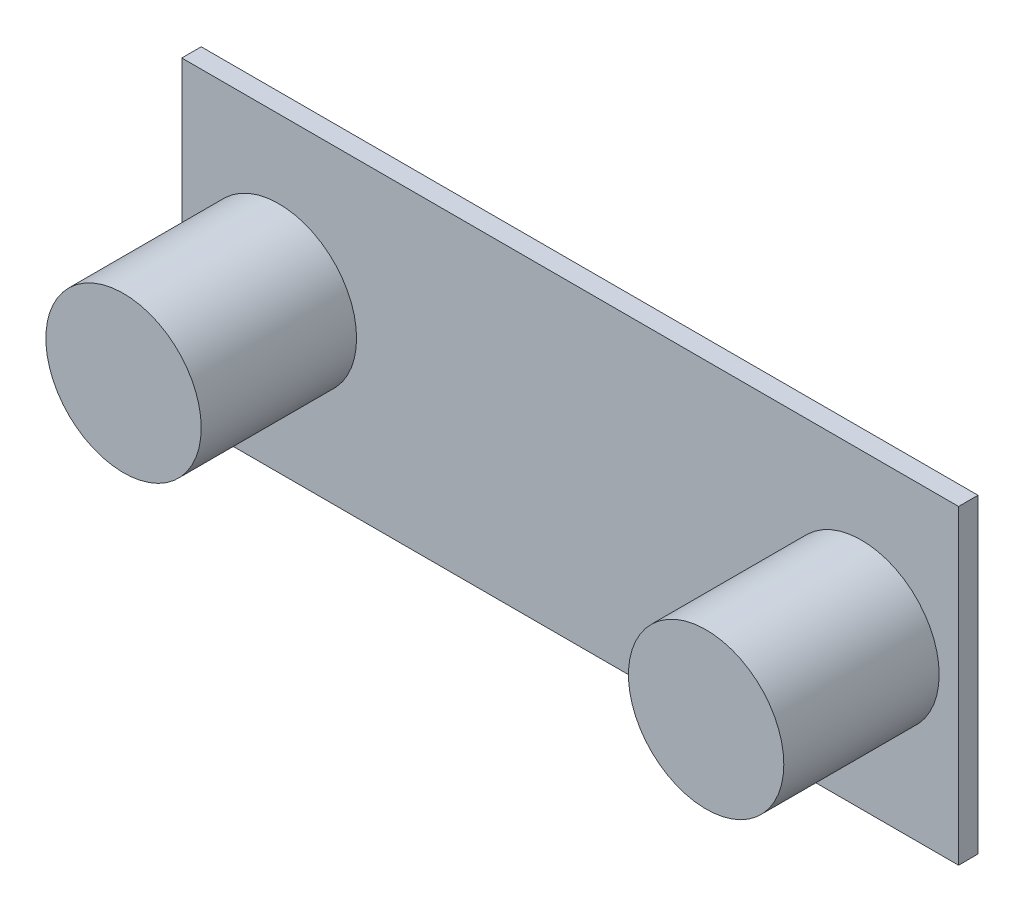
ISO-10303-21;
HEADER;
FILE_DESCRIPTION(('STEP AP214'),'2;1');
FILE_NAME('part.step','',(''),(''),'','','');
FILE_SCHEMA(('AUTOMOTIVE_DESIGN { 1 0 10303 214 1 1 1 1 }'));
ENDSEC;
DATA;
#1=APPLICATION_CONTEXT('core data for automotive mechanical design processes');
#2=APPLICATION_PROTOCOL_DEFINITION('international standard','automotive_design',2000,#1);
#3=PRODUCT_CONTEXT('',#1,'mechanical');
#4=PRODUCT('Part','Part','',(#3));
#5=PRODUCT_RELATED_PRODUCT_CATEGORY('part','',(#4));
#6=PRODUCT_DEFINITION_FORMATION('','',#4);
#7=PRODUCT_DEFINITION_CONTEXT('part definition',#1,'design');
#8=PRODUCT_DEFINITION('design','',#6,#7);
#9=PRODUCT_DEFINITION_SHAPE('','',#8);
#10=(LENGTH_UNIT() NAMED_UNIT(*) SI_UNIT(.MILLI.,.METRE.));
#11=(NAMED_UNIT(*) PLANE_ANGLE_UNIT() SI_UNIT($,.RADIAN.));
#12=(NAMED_UNIT(*) SI_UNIT($,.STERADIAN.) SOLID_ANGLE_UNIT());
#13=UNCERTAINTY_MEASURE_WITH_UNIT(LENGTH_MEASURE(1.E-05),#10,'distance_accuracy_value','');
#14=(GEOMETRIC_REPRESENTATION_CONTEXT(3) GLOBAL_UNCERTAINTY_ASSIGNED_CONTEXT((#13)) GLOBAL_UNIT_ASSIGNED_CONTEXT((#10,
#11,#12)) REPRESENTATION_CONTEXT('',''));
#15=CARTESIAN_POINT('',(0.,0.,0.));
#16=DIRECTION('',(0.,0.,1.));
#17=DIRECTION('',(1.,0.,0.));
#18=AXIS2_PLACEMENT_3D('',#15,#16,#17);
#19=CARTESIAN_POINT('',(-40.,16.,2.));
#20=DIRECTION('',(1.,0.,0.));
#21=DIRECTION('',(0.,1.,0.));
#22=AXIS2_PLACEMENT_3D('',#19,#20,#21);
#23=PLANE('',#22);
#24=DIRECTION('',(0.,-1.,0.));
#25=VECTOR('',#24,1.);
#26=CARTESIAN_POINT('',(-40.,16.,0.));
#27=LINE('',#26,#25);
#28=CARTESIAN_POINT('',(-40.,16.,0.));
#29=VERTEX_POINT('',#28);
#30=CARTESIAN_POINT('',(-40.,-16.,0.));
#31=VERTEX_POINT('',#30);
#32=EDGE_CURVE('E102',#29,#31,#27,.T.);
#33=ORIENTED_EDGE('',*,*,#32,.T.);
#34=DIRECTION('',(0.,0.,-1.));
#35=VECTOR('',#34,1.);
#36=CARTESIAN_POINT('',(-40.,-16.,2.));
#37=LINE('',#36,#35);
#38=CARTESIAN_POINT('',(-40.,-16.,2.));
#39=VERTEX_POINT('',#38);
#40=EDGE_CURVE('E11',#39,#31,#37,.T.);
#41=ORIENTED_EDGE('',*,*,#40,.F.);
#42=DIRECTION('',(0.,-1.,0.));
#43=VECTOR('',#42,1.);
#44=CARTESIAN_POINT('',(-40.,16.,2.));
#45=LINE('',#44,#43);
#46=CARTESIAN_POINT('',(-40.,16.,2.));
#47=VERTEX_POINT('',#46);
#48=EDGE_CURVE('E90',#47,#39,#45,.T.);
#49=ORIENTED_EDGE('',*,*,#48,.F.);
#50=DIRECTION('',(0.,0.,-1.));
#51=VECTOR('',#50,1.);
#52=CARTESIAN_POINT('',(-40.,16.,2.));
#53=LINE('',#52,#51);
#54=EDGE_CURVE('E98',#47,#29,#53,.T.);
#55=ORIENTED_EDGE('',*,*,#54,.T.);
#56=EDGE_LOOP('',(#33,#41,#49,#55));
#57=FACE_BOUND('',#56,.T.);
#58=ADVANCED_FACE('F39',(#57),#23,.F.);
#59=CARTESIAN_POINT('',(-40.,-16.,2.));
#60=DIRECTION('',(0.,1.,0.));
#61=DIRECTION('',(0.,0.,1.));
#62=AXIS2_PLACEMENT_3D('',#59,#60,#61);
#63=PLANE('',#62);
#64=DIRECTION('',(1.,0.,0.));
#65=VECTOR('',#64,1.);
#66=CARTESIAN_POINT('',(-40.,-16.,0.));
#67=LINE('',#66,#65);
#68=CARTESIAN_POINT('',(40.,-16.,0.));
#69=VERTEX_POINT('',#68);
#70=EDGE_CURVE('E94',#31,#69,#67,.T.);
#71=ORIENTED_EDGE('',*,*,#70,.T.);
#72=DIRECTION('',(0.,0.,-1.));
#73=VECTOR('',#72,1.);
#74=CARTESIAN_POINT('',(40.,-16.,2.));
#75=LINE('',#74,#73);
#76=CARTESIAN_POINT('',(40.,-16.,2.));
#77=VERTEX_POINT('',#76);
#78=EDGE_CURVE('E47',#77,#69,#75,.T.);
#79=ORIENTED_EDGE('',*,*,#78,.F.);
#80=DIRECTION('',(1.,0.,0.));
#81=VECTOR('',#80,1.);
#82=CARTESIAN_POINT('',(-40.,-16.,2.));
#83=LINE('',#82,#81);
#84=EDGE_CURVE('E85',#39,#77,#83,.T.);
#85=ORIENTED_EDGE('',*,*,#84,.F.);
#86=ORIENTED_EDGE('',*,*,#40,.T.);
#87=EDGE_LOOP('',(#71,#79,#85,#86));
#88=FACE_BOUND('',#87,.T.);
#89=ADVANCED_FACE('F93',(#88),#63,.F.);
#90=CARTESIAN_POINT('',(40.,16.,2.));
#91=DIRECTION('',(-1.,0.,0.));
#92=DIRECTION('',(0.,-1.,0.));
#93=AXIS2_PLACEMENT_3D('',#90,#91,#92);
#94=PLANE('',#93);
#95=DIRECTION('',(0.,1.,0.));
#96=VECTOR('',#95,1.);
#97=CARTESIAN_POINT('',(40.,16.,0.));
#98=LINE('',#97,#96);
#99=CARTESIAN_POINT('',(40.,16.,0.));
#100=VERTEX_POINT('',#99);
#101=EDGE_CURVE('E72',#69,#100,#98,.T.);
#102=ORIENTED_EDGE('',*,*,#101,.T.);
#103=DIRECTION('',(0.,0.,-1.));
#104=VECTOR('',#103,1.);
#105=CARTESIAN_POINT('',(40.,16.,2.));
#106=LINE('',#105,#104);
#107=CARTESIAN_POINT('',(40.,16.,2.));
#108=VERTEX_POINT('',#107);
#109=EDGE_CURVE('E95',#108,#100,#106,.T.);
#110=ORIENTED_EDGE('',*,*,#109,.F.);
#111=DIRECTION('',(0.,1.,0.));
#112=VECTOR('',#111,1.);
#113=CARTESIAN_POINT('',(40.,16.,2.));
#114=LINE('',#113,#112);
#115=EDGE_CURVE('E88',#77,#108,#114,.T.);
#116=ORIENTED_EDGE('',*,*,#115,.F.);
#117=ORIENTED_EDGE('',*,*,#78,.T.);
#118=EDGE_LOOP('',(#102,#110,#116,#117));
#119=FACE_BOUND('',#118,.T.);
#120=ADVANCED_FACE('F96',(#119),#94,.F.);
#121=CARTESIAN_POINT('',(-40.,16.,2.));
#122=DIRECTION('',(0.,-1.,0.));
#123=DIRECTION('',(1.,0.,0.));
#124=AXIS2_PLACEMENT_3D('',#121,#122,#123);
#125=PLANE('',#124);
#126=DIRECTION('',(-1.,0.,0.));
#127=VECTOR('',#126,1.);
#128=CARTESIAN_POINT('',(-40.,16.,0.));
#129=LINE('',#128,#127);
#130=EDGE_CURVE('E78',#100,#29,#129,.T.);
#131=ORIENTED_EDGE('',*,*,#130,.T.);
#132=ORIENTED_EDGE('',*,*,#54,.F.);
#133=DIRECTION('',(-1.,0.,0.));
#134=VECTOR('',#133,1.);
#135=CARTESIAN_POINT('',(-40.,16.,2.));
#136=LINE('',#135,#134);
#137=EDGE_CURVE('E55',#108,#47,#136,.T.);
#138=ORIENTED_EDGE('',*,*,#137,.F.);
#139=ORIENTED_EDGE('',*,*,#109,.T.);
#140=EDGE_LOOP('',(#131,#132,#138,#139));
#141=FACE_BOUND('',#140,.T.);
#142=ADVANCED_FACE('F110',(#141),#125,.F.);
#143=CARTESIAN_POINT('',(0.,0.,2.));
#144=DIRECTION('',(0.,0.,1.));
#145=DIRECTION('',(1.,0.,0.));
#146=AXIS2_PLACEMENT_3D('',#143,#144,#145);
#147=PLANE('',#146);
#148=CARTESIAN_POINT('',(30.,0.,2.));
#149=DIRECTION('',(0.,0.,1.));
#150=DIRECTION('',(1.,0.,0.));
#151=AXIS2_PLACEMENT_3D('',#148,#149,#150);
#152=CIRCLE('',#151,8.);
#153=CARTESIAN_POINT('',(38.,0.,2.));
#154=VERTEX_POINT('',#153);
#155=EDGE_CURVE('E119',#154,#154,#152,.T.);
#156=ORIENTED_EDGE('',*,*,#155,.F.);
#157=EDGE_LOOP('',(#156));
#158=FACE_BOUND('',#157,.T.);
#159=CARTESIAN_POINT('',(-30.,0.,2.));
#160=DIRECTION('',(0.,0.,1.));
#161=DIRECTION('',(1.,0.,0.));
#162=AXIS2_PLACEMENT_3D('',#159,#160,#161);
#163=CIRCLE('',#162,8.);
#164=CARTESIAN_POINT('',(-22.,0.,2.));
#165=VERTEX_POINT('',#164);
#166=EDGE_CURVE('E116',#165,#165,#163,.T.);
#167=ORIENTED_EDGE('',*,*,#166,.F.);
#168=EDGE_LOOP('',(#167));
#169=FACE_BOUND('',#168,.T.);
#170=ORIENTED_EDGE('',*,*,#48,.T.);
#171=ORIENTED_EDGE('',*,*,#84,.T.);
#172=ORIENTED_EDGE('',*,*,#115,.T.);
#173=ORIENTED_EDGE('',*,*,#137,.T.);
#174=EDGE_LOOP('',(#170,#171,#172,#173));
#175=FACE_BOUND('',#174,.T.);
#176=ADVANCED_FACE('F86',(#158,#169,#175),#147,.T.);
#177=CARTESIAN_POINT('',(0.,0.,0.));
#178=DIRECTION('',(0.,0.,1.));
#179=DIRECTION('',(1.,0.,0.));
#180=AXIS2_PLACEMENT_3D('',#177,#178,#179);
#181=PLANE('',#180);
#182=ORIENTED_EDGE('',*,*,#32,.F.);
#183=ORIENTED_EDGE('',*,*,#130,.F.);
#184=ORIENTED_EDGE('',*,*,#101,.F.);
#185=ORIENTED_EDGE('',*,*,#70,.F.);
#186=EDGE_LOOP('',(#182,#183,#184,#185));
#187=FACE_BOUND('',#186,.T.);
#188=ADVANCED_FACE('F113',(#187),#181,.F.);
#189=CARTESIAN_POINT('',(-30.,0.,18.));
#190=DIRECTION('',(0.,0.,-1.));
#191=DIRECTION('',(-1.,0.,0.));
#192=AXIS2_PLACEMENT_3D('',#189,#190,#191);
#193=CYLINDRICAL_SURFACE('',#192,8.);
#194=CARTESIAN_POINT('',(-30.,0.,18.));
#195=DIRECTION('',(0.,0.,1.));
#196=DIRECTION('',(1.,0.,0.));
#197=AXIS2_PLACEMENT_3D('',#194,#195,#196);
#198=CIRCLE('',#197,8.);
#199=CARTESIAN_POINT('',(-22.,0.,18.));
#200=VERTEX_POINT('',#199);
#201=EDGE_CURVE('E105',#200,#200,#198,.T.);
#202=ORIENTED_EDGE('',*,*,#201,.F.);
#203=EDGE_LOOP('',(#202));
#204=FACE_BOUND('',#203,.T.);
#205=ORIENTED_EDGE('',*,*,#166,.T.);
#206=EDGE_LOOP('',(#205));
#207=FACE_BOUND('',#206,.T.);
#208=ADVANCED_FACE('F135',(#204,#207),#193,.T.);
#209=CARTESIAN_POINT('',(-30.,0.,18.));
#210=DIRECTION('',(0.,0.,1.));
#211=DIRECTION('',(1.,0.,0.));
#212=AXIS2_PLACEMENT_3D('',#209,#210,#211);
#213=PLANE('',#212);
#214=ORIENTED_EDGE('',*,*,#201,.T.);
#215=EDGE_LOOP('',(#214));
#216=FACE_BOUND('',#215,.T.);
#217=ADVANCED_FACE('F137',(#216),#213,.T.);
#218=CARTESIAN_POINT('',(30.,0.,18.));
#219=DIRECTION('',(0.,0.,-1.));
#220=DIRECTION('',(-1.,0.,0.));
#221=AXIS2_PLACEMENT_3D('',#218,#219,#220);
#222=CYLINDRICAL_SURFACE('',#221,8.);
#223=CARTESIAN_POINT('',(30.,0.,18.));
#224=DIRECTION('',(0.,0.,1.));
#225=DIRECTION('',(1.,0.,0.));
#226=AXIS2_PLACEMENT_3D('',#223,#224,#225);
#227=CIRCLE('',#226,8.);
#228=CARTESIAN_POINT('',(38.,0.,18.));
#229=VERTEX_POINT('',#228);
#230=EDGE_CURVE('E122',#229,#229,#227,.T.);
#231=ORIENTED_EDGE('',*,*,#230,.F.);
#232=EDGE_LOOP('',(#231));
#233=FACE_BOUND('',#232,.T.);
#234=ORIENTED_EDGE('',*,*,#155,.T.);
#235=EDGE_LOOP('',(#234));
#236=FACE_BOUND('',#235,.T.);
#237=ADVANCED_FACE('F128',(#233,#236),#222,.T.);
#238=CARTESIAN_POINT('',(30.,0.,18.));
#239=DIRECTION('',(0.,0.,1.));
#240=DIRECTION('',(1.,0.,0.));
#241=AXIS2_PLACEMENT_3D('',#238,#239,#240);
#242=PLANE('',#241);
#243=ORIENTED_EDGE('',*,*,#230,.T.);
#244=EDGE_LOOP('',(#243));
#245=FACE_BOUND('',#244,.T.);
#246=ADVANCED_FACE('F189',(#245),#242,.T.);
#247=CLOSED_SHELL('',(#58,#89,#120,#142,#176,#188,#208,#217,#237,#246));
#248=MANIFOLD_SOLID_BREP('B2',#247);
#249=ADVANCED_BREP_SHAPE_REPRESENTATION('',(#18,#248),#14);
#250=SHAPE_DEFINITION_REPRESENTATION(#9,#249);
ENDSEC;
END-ISO-10303-21;
